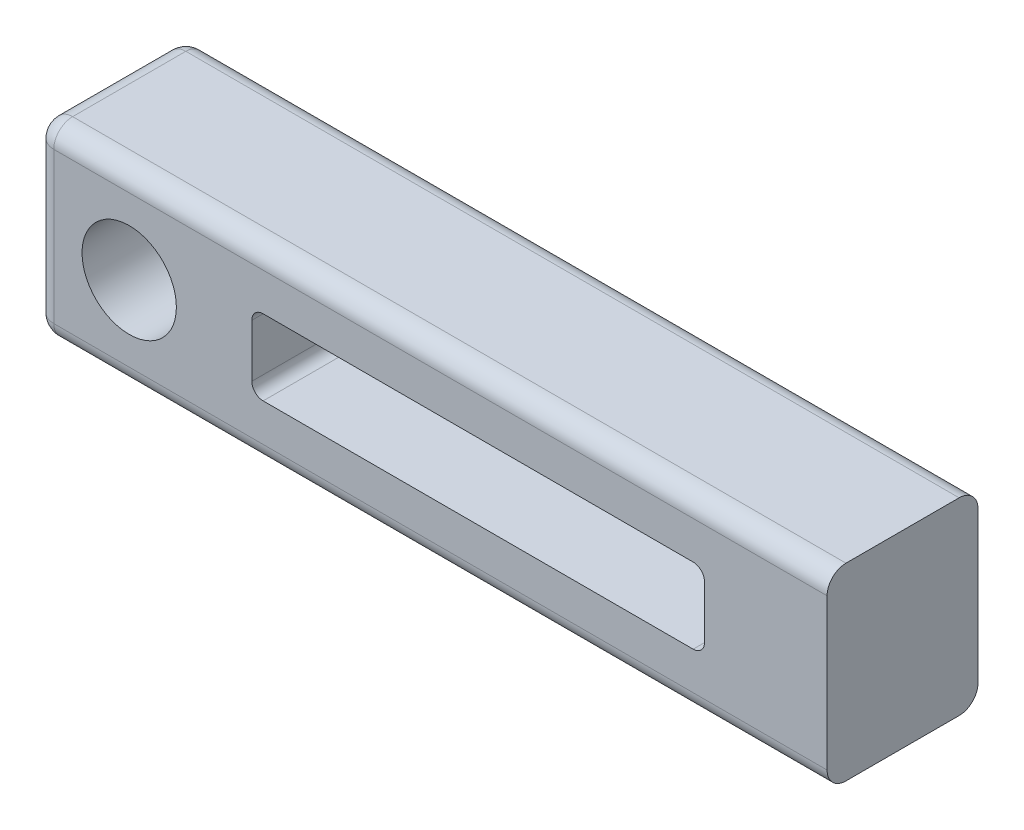
ISO-10303-21;
HEADER;
FILE_DESCRIPTION(('STEP AP214'),'2;1');
FILE_NAME('part.step','',(''),(''),'','','');
FILE_SCHEMA(('AUTOMOTIVE_DESIGN { 1 0 10303 214 1 1 1 1 }'));
ENDSEC;
DATA;
#1=APPLICATION_CONTEXT('core data for automotive mechanical design processes');
#2=APPLICATION_PROTOCOL_DEFINITION('international standard','automotive_design',2000,#1);
#3=PRODUCT_CONTEXT('',#1,'mechanical');
#4=PRODUCT('Part','Part','',(#3));
#5=PRODUCT_RELATED_PRODUCT_CATEGORY('part','',(#4));
#6=PRODUCT_DEFINITION_FORMATION('','',#4);
#7=PRODUCT_DEFINITION_CONTEXT('part definition',#1,'design');
#8=PRODUCT_DEFINITION('design','',#6,#7);
#9=PRODUCT_DEFINITION_SHAPE('','',#8);
#10=(LENGTH_UNIT() NAMED_UNIT(*) SI_UNIT(.MILLI.,.METRE.));
#11=(NAMED_UNIT(*) PLANE_ANGLE_UNIT() SI_UNIT($,.RADIAN.));
#12=(NAMED_UNIT(*) SI_UNIT($,.STERADIAN.) SOLID_ANGLE_UNIT());
#13=UNCERTAINTY_MEASURE_WITH_UNIT(LENGTH_MEASURE(1.E-05),#10,'distance_accuracy_value','');
#14=(GEOMETRIC_REPRESENTATION_CONTEXT(3) GLOBAL_UNCERTAINTY_ASSIGNED_CONTEXT((#13)) GLOBAL_UNIT_ASSIGNED_CONTEXT((#10,
#11,#12)) REPRESENTATION_CONTEXT('',''));
#15=CARTESIAN_POINT('',(0.,0.,0.));
#16=DIRECTION('',(0.,0.,1.));
#17=DIRECTION('',(1.,0.,0.));
#18=AXIS2_PLACEMENT_3D('',#15,#16,#17);
#19=CARTESIAN_POINT('',(0.,0.,40.));
#20=DIRECTION('',(0.,0.,-1.));
#21=DIRECTION('',(-1.,0.,0.));
#22=AXIS2_PLACEMENT_3D('',#19,#20,#21);
#23=PLANE('',#22);
#24=DIRECTION('',(0.,-1.,0.));
#25=VECTOR('',#24,1.);
#26=CARTESIAN_POINT('',(32.5007823221935,6.99999999999997,40.));
#27=LINE('',#26,#25);
#28=CARTESIAN_POINT('',(32.5007823221935,6.99999999999997,40.));
#29=VERTEX_POINT('',#28);
#30=CARTESIAN_POINT('',(32.5007823221935,-6.99999999999997,40.));
#31=VERTEX_POINT('',#30);
#32=EDGE_CURVE('E204',#29,#31,#27,.T.);
#33=ORIENTED_EDGE('',*,*,#32,.F.);
#34=CARTESIAN_POINT('',(35.5007823221935,7.,40.));
#35=DIRECTION('',(0.,0.,1.));
#36=DIRECTION('',(-1.,0.,0.));
#37=AXIS2_PLACEMENT_3D('',#34,#35,#36);
#38=CIRCLE('',#37,3.);
#39=CARTESIAN_POINT('',(35.5007823221935,9.99999999999999,40.));
#40=VERTEX_POINT('',#39);
#41=EDGE_CURVE('E56',#40,#29,#38,.T.);
#42=ORIENTED_EDGE('',*,*,#41,.F.);
#43=DIRECTION('',(-1.,0.,0.));
#44=VECTOR('',#43,1.);
#45=CARTESIAN_POINT('',(149.499217677806,9.99999999999999,40.));
#46=LINE('',#45,#44);
#47=CARTESIAN_POINT('',(149.499217677806,9.99999999999999,40.));
#48=VERTEX_POINT('',#47);
#49=EDGE_CURVE('E184',#48,#40,#46,.T.);
#50=ORIENTED_EDGE('',*,*,#49,.F.);
#51=CARTESIAN_POINT('',(149.499217677806,6.99999999999999,40.));
#52=DIRECTION('',(0.,0.,1.));
#53=DIRECTION('',(1.,0.,0.));
#54=AXIS2_PLACEMENT_3D('',#51,#52,#53);
#55=CIRCLE('',#54,3.);
#56=CARTESIAN_POINT('',(152.499217677806,6.99999999999997,40.));
#57=VERTEX_POINT('',#56);
#58=EDGE_CURVE('E187',#57,#48,#55,.T.);
#59=ORIENTED_EDGE('',*,*,#58,.F.);
#60=DIRECTION('',(0.,1.,0.));
#61=VECTOR('',#60,1.);
#62=CARTESIAN_POINT('',(152.499217677806,6.99999999999997,40.));
#63=LINE('',#62,#61);
#64=CARTESIAN_POINT('',(152.499217677806,-6.99999999999993,40.));
#65=VERTEX_POINT('',#64);
#66=EDGE_CURVE('E215',#65,#57,#63,.T.);
#67=ORIENTED_EDGE('',*,*,#66,.F.);
#68=CARTESIAN_POINT('',(149.499217677806,-6.99999999999995,40.));
#69=DIRECTION('',(0.,0.,1.));
#70=DIRECTION('',(-1.,0.,0.));
#71=AXIS2_PLACEMENT_3D('',#68,#69,#70);
#72=CIRCLE('',#71,3.);
#73=CARTESIAN_POINT('',(149.499217677806,-9.99999999999995,40.));
#74=VERTEX_POINT('',#73);
#75=EDGE_CURVE('E212',#74,#65,#72,.T.);
#76=ORIENTED_EDGE('',*,*,#75,.F.);
#77=DIRECTION('',(1.,0.,0.));
#78=VECTOR('',#77,1.);
#79=CARTESIAN_POINT('',(149.499217677806,-9.99999999999995,40.));
#80=LINE('',#79,#78);
#81=CARTESIAN_POINT('',(35.5007823221935,-9.99999999999999,40.));
#82=VERTEX_POINT('',#81);
#83=EDGE_CURVE('E209',#82,#74,#80,.T.);
#84=ORIENTED_EDGE('',*,*,#83,.F.);
#85=CARTESIAN_POINT('',(35.5007823221935,-6.99999999999999,40.));
#86=DIRECTION('',(0.,0.,1.));
#87=DIRECTION('',(1.,0.,0.));
#88=AXIS2_PLACEMENT_3D('',#85,#86,#87);
#89=CIRCLE('',#88,3.);
#90=EDGE_CURVE('E206',#31,#82,#89,.T.);
#91=ORIENTED_EDGE('',*,*,#90,.F.);
#92=EDGE_LOOP('',(#33,#42,#50,#59,#67,#76,#84,#91));
#93=FACE_BOUND('',#92,.T.);
#94=DIRECTION('',(0.,-1.,0.));
#95=VECTOR('',#94,1.);
#96=CARTESIAN_POINT('',(-20.,0.,40.));
#97=LINE('',#96,#95);
#98=CARTESIAN_POINT('',(-20.,20.,40.));
#99=VERTEX_POINT('',#98);
#100=CARTESIAN_POINT('',(-20.,-20.,40.));
#101=VERTEX_POINT('',#100);
#102=EDGE_CURVE('E276',#99,#101,#97,.T.);
#103=ORIENTED_EDGE('',*,*,#102,.T.);
#104=DIRECTION('',(1.,0.,0.));
#105=VECTOR('',#104,1.);
#106=CARTESIAN_POINT('',(0.,-20.,40.));
#107=LINE('',#106,#105);
#108=CARTESIAN_POINT('',(185.,-19.9999999999999,40.));
#109=VERTEX_POINT('',#108);
#110=EDGE_CURVE('E278',#101,#109,#107,.T.);
#111=ORIENTED_EDGE('',*,*,#110,.T.);
#112=DIRECTION('',(0.,1.,0.));
#113=VECTOR('',#112,1.);
#114=CARTESIAN_POINT('',(185.,25.,40.));
#115=LINE('',#114,#113);
#116=CARTESIAN_POINT('',(185.,20.,40.));
#117=VERTEX_POINT('',#116);
#118=EDGE_CURVE('E243',#109,#117,#115,.T.);
#119=ORIENTED_EDGE('',*,*,#118,.T.);
#120=DIRECTION('',(-1.,0.,0.));
#121=VECTOR('',#120,1.);
#122=CARTESIAN_POINT('',(0.,20.,40.));
#123=LINE('',#122,#121);
#124=EDGE_CURVE('E274',#117,#99,#123,.T.);
#125=ORIENTED_EDGE('',*,*,#124,.T.);
#126=EDGE_LOOP('',(#103,#111,#119,#125));
#127=FACE_BOUND('',#126,.T.);
#128=CARTESIAN_POINT('',(0.,0.,40.));
#129=DIRECTION('',(0.,0.,1.));
#130=DIRECTION('',(1.,0.,0.));
#131=AXIS2_PLACEMENT_3D('',#128,#129,#130);
#132=CIRCLE('',#131,12.5);
#133=CARTESIAN_POINT('',(12.5,0.,40.));
#134=VERTEX_POINT('',#133);
#135=EDGE_CURVE('E234',#134,#134,#132,.T.);
#136=ORIENTED_EDGE('',*,*,#135,.F.);
#137=EDGE_LOOP('',(#136));
#138=FACE_BOUND('',#137,.T.);
#139=ADVANCED_FACE('F39',(#93,#127,#138),#23,.F.);
#140=CARTESIAN_POINT('',(0.,0.,0.));
#141=DIRECTION('',(0.,0.,-1.));
#142=DIRECTION('',(-1.,0.,0.));
#143=AXIS2_PLACEMENT_3D('',#140,#141,#142);
#144=PLANE('',#143);
#145=CARTESIAN_POINT('',(35.5007823221935,7.,0.));
#146=DIRECTION('',(0.,0.,1.));
#147=DIRECTION('',(-1.,0.,0.));
#148=AXIS2_PLACEMENT_3D('',#145,#146,#147);
#149=CIRCLE('',#148,3.);
#150=CARTESIAN_POINT('',(35.5007823221935,9.99999999999999,0.));
#151=VERTEX_POINT('',#150);
#152=CARTESIAN_POINT('',(32.5007823221935,6.99999999999997,0.));
#153=VERTEX_POINT('',#152);
#154=EDGE_CURVE('E167',#151,#153,#149,.T.);
#155=ORIENTED_EDGE('',*,*,#154,.T.);
#156=DIRECTION('',(0.,-1.,0.));
#157=VECTOR('',#156,1.);
#158=CARTESIAN_POINT('',(32.5007823221935,6.99999999999997,0.));
#159=LINE('',#158,#157);
#160=CARTESIAN_POINT('',(32.5007823221935,-6.99999999999997,0.));
#161=VERTEX_POINT('',#160);
#162=EDGE_CURVE('E176',#153,#161,#159,.T.);
#163=ORIENTED_EDGE('',*,*,#162,.T.);
#164=CARTESIAN_POINT('',(35.5007823221935,-6.99999999999999,0.));
#165=DIRECTION('',(0.,0.,1.));
#166=DIRECTION('',(1.,0.,0.));
#167=AXIS2_PLACEMENT_3D('',#164,#165,#166);
#168=CIRCLE('',#167,3.);
#169=CARTESIAN_POINT('',(35.5007823221935,-9.99999999999999,0.));
#170=VERTEX_POINT('',#169);
#171=EDGE_CURVE('E64',#161,#170,#168,.T.);
#172=ORIENTED_EDGE('',*,*,#171,.T.);
#173=DIRECTION('',(1.,0.,0.));
#174=VECTOR('',#173,1.);
#175=CARTESIAN_POINT('',(149.499217677806,-9.99999999999995,0.));
#176=LINE('',#175,#174);
#177=CARTESIAN_POINT('',(149.499217677806,-9.99999999999995,0.));
#178=VERTEX_POINT('',#177);
#179=EDGE_CURVE('E191',#170,#178,#176,.T.);
#180=ORIENTED_EDGE('',*,*,#179,.T.);
#181=CARTESIAN_POINT('',(149.499217677806,-6.99999999999995,0.));
#182=DIRECTION('',(0.,0.,1.));
#183=DIRECTION('',(-1.,0.,0.));
#184=AXIS2_PLACEMENT_3D('',#181,#182,#183);
#185=CIRCLE('',#184,3.);
#186=CARTESIAN_POINT('',(152.499217677806,-6.99999999999993,0.));
#187=VERTEX_POINT('',#186);
#188=EDGE_CURVE('E194',#178,#187,#185,.T.);
#189=ORIENTED_EDGE('',*,*,#188,.T.);
#190=DIRECTION('',(0.,1.,0.));
#191=VECTOR('',#190,1.);
#192=CARTESIAN_POINT('',(152.499217677806,6.99999999999997,0.));
#193=LINE('',#192,#191);
#194=CARTESIAN_POINT('',(152.499217677806,6.99999999999997,0.));
#195=VERTEX_POINT('',#194);
#196=EDGE_CURVE('E197',#187,#195,#193,.T.);
#197=ORIENTED_EDGE('',*,*,#196,.T.);
#198=CARTESIAN_POINT('',(149.499217677806,6.99999999999999,0.));
#199=DIRECTION('',(0.,0.,1.));
#200=DIRECTION('',(1.,0.,0.));
#201=AXIS2_PLACEMENT_3D('',#198,#199,#200);
#202=CIRCLE('',#201,3.);
#203=CARTESIAN_POINT('',(149.499217677806,9.99999999999999,0.));
#204=VERTEX_POINT('',#203);
#205=EDGE_CURVE('E200',#195,#204,#202,.T.);
#206=ORIENTED_EDGE('',*,*,#205,.T.);
#207=DIRECTION('',(-1.,0.,0.));
#208=VECTOR('',#207,1.);
#209=CARTESIAN_POINT('',(149.499217677806,9.99999999999999,0.));
#210=LINE('',#209,#208);
#211=EDGE_CURVE('E173',#204,#151,#210,.T.);
#212=ORIENTED_EDGE('',*,*,#211,.T.);
#213=EDGE_LOOP('',(#155,#163,#172,#180,#189,#197,#206,#212));
#214=FACE_BOUND('',#213,.T.);
#215=DIRECTION('',(0.,1.,0.));
#216=VECTOR('',#215,1.);
#217=CARTESIAN_POINT('',(185.,25.,0.));
#218=LINE('',#217,#216);
#219=CARTESIAN_POINT('',(185.,-19.9999999999999,0.));
#220=VERTEX_POINT('',#219);
#221=CARTESIAN_POINT('',(185.,20.,0.));
#222=VERTEX_POINT('',#221);
#223=EDGE_CURVE('E238',#220,#222,#218,.T.);
#224=ORIENTED_EDGE('',*,*,#223,.F.);
#225=DIRECTION('',(1.,0.,0.));
#226=VECTOR('',#225,1.);
#227=CARTESIAN_POINT('',(-25.,-20.,0.));
#228=LINE('',#227,#226);
#229=CARTESIAN_POINT('',(-20.,-20.,0.));
#230=VERTEX_POINT('',#229);
#231=EDGE_CURVE('E290',#220,#230,#228,.F.);
#232=ORIENTED_EDGE('',*,*,#231,.T.);
#233=DIRECTION('',(0.,-1.,0.));
#234=VECTOR('',#233,1.);
#235=CARTESIAN_POINT('',(-20.,25.,0.));
#236=LINE('',#235,#234);
#237=CARTESIAN_POINT('',(-20.,20.,0.));
#238=VERTEX_POINT('',#237);
#239=EDGE_CURVE('E288',#230,#238,#236,.F.);
#240=ORIENTED_EDGE('',*,*,#239,.T.);
#241=DIRECTION('',(-1.,0.,0.));
#242=VECTOR('',#241,1.);
#243=CARTESIAN_POINT('',(185.,20.,0.));
#244=LINE('',#243,#242);
#245=EDGE_CURVE('E286',#238,#222,#244,.F.);
#246=ORIENTED_EDGE('',*,*,#245,.T.);
#247=EDGE_LOOP('',(#224,#232,#240,#246));
#248=FACE_BOUND('',#247,.T.);
#249=CARTESIAN_POINT('',(0.,0.,0.));
#250=DIRECTION('',(0.,0.,1.));
#251=DIRECTION('',(1.,0.,0.));
#252=AXIS2_PLACEMENT_3D('',#249,#250,#251);
#253=CIRCLE('',#252,12.5);
#254=CARTESIAN_POINT('',(12.5,0.,0.));
#255=VERTEX_POINT('',#254);
#256=EDGE_CURVE('E239',#255,#255,#253,.T.);
#257=ORIENTED_EDGE('',*,*,#256,.T.);
#258=EDGE_LOOP('',(#257));
#259=FACE_BOUND('',#258,.T.);
#260=ADVANCED_FACE('F180',(#214,#248,#259),#144,.T.);
#261=CARTESIAN_POINT('',(-25.,-25.,40.));
#262=DIRECTION('',(0.,1.,0.));
#263=DIRECTION('',(-1.,0.,0.));
#264=AXIS2_PLACEMENT_3D('',#261,#262,#263);
#265=PLANE('',#264);
#266=DIRECTION('',(0.,0.,-1.));
#267=VECTOR('',#266,1.);
#268=CARTESIAN_POINT('',(185.,-25.,40.));
#269=LINE('',#268,#267);
#270=CARTESIAN_POINT('',(185.,-25.,35.));
#271=VERTEX_POINT('',#270);
#272=CARTESIAN_POINT('',(185.,-25.,5.));
#273=VERTEX_POINT('',#272);
#274=EDGE_CURVE('E254',#271,#273,#269,.T.);
#275=ORIENTED_EDGE('',*,*,#274,.F.);
#276=DIRECTION('',(1.,0.,0.));
#277=VECTOR('',#276,1.);
#278=CARTESIAN_POINT('',(-25.,-25.,35.));
#279=LINE('',#278,#277);
#280=CARTESIAN_POINT('',(-20.,-25.,35.));
#281=VERTEX_POINT('',#280);
#282=EDGE_CURVE('E284',#271,#281,#279,.F.);
#283=ORIENTED_EDGE('',*,*,#282,.T.);
#284=DIRECTION('',(0.,0.,-1.));
#285=VECTOR('',#284,1.);
#286=CARTESIAN_POINT('',(-20.,-25.,40.));
#287=LINE('',#286,#285);
#288=CARTESIAN_POINT('',(-20.,-25.,5.));
#289=VERTEX_POINT('',#288);
#290=EDGE_CURVE('E282',#281,#289,#287,.T.);
#291=ORIENTED_EDGE('',*,*,#290,.T.);
#292=DIRECTION('',(1.,0.,0.));
#293=VECTOR('',#292,1.);
#294=CARTESIAN_POINT('',(185.,-25.,5.));
#295=LINE('',#294,#293);
#296=EDGE_CURVE('E280',#289,#273,#295,.T.);
#297=ORIENTED_EDGE('',*,*,#296,.T.);
#298=EDGE_LOOP('',(#275,#283,#291,#297));
#299=FACE_BOUND('',#298,.T.);
#300=ADVANCED_FACE('F353',(#299),#265,.F.);
#301=CARTESIAN_POINT('',(185.,25.,40.));
#302=DIRECTION('',(-1.,0.,0.));
#303=DIRECTION('',(0.,0.,1.));
#304=AXIS2_PLACEMENT_3D('',#301,#302,#303);
#305=PLANE('',#304);
#306=ORIENTED_EDGE('',*,*,#118,.F.);
#307=CARTESIAN_POINT('',(185.,-19.9999999999999,35.));
#308=DIRECTION('',(-1.,0.,0.));
#309=DIRECTION('',(0.,0.,1.));
#310=AXIS2_PLACEMENT_3D('',#307,#308,#309);
#311=CIRCLE('',#310,5.);
#312=EDGE_CURVE('E11',#109,#271,#311,.F.);
#313=ORIENTED_EDGE('',*,*,#312,.T.);
#314=ORIENTED_EDGE('',*,*,#274,.T.);
#315=CARTESIAN_POINT('',(185.,-19.9999999999999,5.));
#316=DIRECTION('',(-1.,0.,0.));
#317=DIRECTION('',(0.,0.,1.));
#318=AXIS2_PLACEMENT_3D('',#315,#316,#317);
#319=CIRCLE('',#318,5.);
#320=EDGE_CURVE('E48',#273,#220,#319,.F.);
#321=ORIENTED_EDGE('',*,*,#320,.T.);
#322=ORIENTED_EDGE('',*,*,#223,.T.);
#323=CARTESIAN_POINT('',(185.,20.,5.));
#324=DIRECTION('',(-1.,0.,0.));
#325=DIRECTION('',(0.,0.,1.));
#326=AXIS2_PLACEMENT_3D('',#323,#324,#325);
#327=CIRCLE('',#326,5.);
#328=CARTESIAN_POINT('',(185.,25.,5.));
#329=VERTEX_POINT('',#328);
#330=EDGE_CURVE('E294',#222,#329,#327,.F.);
#331=ORIENTED_EDGE('',*,*,#330,.T.);
#332=DIRECTION('',(0.,0.,-1.));
#333=VECTOR('',#332,1.);
#334=CARTESIAN_POINT('',(185.,25.,40.));
#335=LINE('',#334,#333);
#336=CARTESIAN_POINT('',(185.,25.,35.));
#337=VERTEX_POINT('',#336);
#338=EDGE_CURVE('E247',#337,#329,#335,.T.);
#339=ORIENTED_EDGE('',*,*,#338,.F.);
#340=CARTESIAN_POINT('',(185.,20.,35.));
#341=DIRECTION('',(-1.,0.,0.));
#342=DIRECTION('',(0.,0.,1.));
#343=AXIS2_PLACEMENT_3D('',#340,#341,#342);
#344=CIRCLE('',#343,5.);
#345=EDGE_CURVE('E292',#337,#117,#344,.F.);
#346=ORIENTED_EDGE('',*,*,#345,.T.);
#347=EDGE_LOOP('',(#306,#313,#314,#321,#322,#331,#339,#346));
#348=FACE_BOUND('',#347,.T.);
#349=ADVANCED_FACE('F363',(#348),#305,.F.);
#350=CARTESIAN_POINT('',(-25.,25.,40.));
#351=DIRECTION('',(0.,-1.,0.));
#352=DIRECTION('',(0.,0.,-1.));
#353=AXIS2_PLACEMENT_3D('',#350,#351,#352);
#354=PLANE('',#353);
#355=ORIENTED_EDGE('',*,*,#338,.T.);
#356=DIRECTION('',(-1.,0.,0.));
#357=VECTOR('',#356,1.);
#358=CARTESIAN_POINT('',(-25.,25.,5.));
#359=LINE('',#358,#357);
#360=CARTESIAN_POINT('',(-20.,25.,5.));
#361=VERTEX_POINT('',#360);
#362=EDGE_CURVE('E272',#329,#361,#359,.T.);
#363=ORIENTED_EDGE('',*,*,#362,.T.);
#364=DIRECTION('',(0.,0.,-1.));
#365=VECTOR('',#364,1.);
#366=CARTESIAN_POINT('',(-20.,25.,40.));
#367=LINE('',#366,#365);
#368=CARTESIAN_POINT('',(-20.,25.,35.));
#369=VERTEX_POINT('',#368);
#370=EDGE_CURVE('E269',#361,#369,#367,.F.);
#371=ORIENTED_EDGE('',*,*,#370,.T.);
#372=DIRECTION('',(-1.,0.,0.));
#373=VECTOR('',#372,1.);
#374=CARTESIAN_POINT('',(-25.,25.,35.));
#375=LINE('',#374,#373);
#376=EDGE_CURVE('E267',#369,#337,#375,.F.);
#377=ORIENTED_EDGE('',*,*,#376,.T.);
#378=EDGE_LOOP('',(#355,#363,#371,#377));
#379=FACE_BOUND('',#378,.T.);
#380=ADVANCED_FACE('F382',(#379),#354,.F.);
#381=CARTESIAN_POINT('',(-25.,-25.,40.));
#382=DIRECTION('',(1.,0.,0.));
#383=DIRECTION('',(0.,1.,0.));
#384=AXIS2_PLACEMENT_3D('',#381,#382,#383);
#385=PLANE('',#384);
#386=DIRECTION('',(0.,-1.,0.));
#387=VECTOR('',#386,1.);
#388=CARTESIAN_POINT('',(-25.,-25.,35.));
#389=LINE('',#388,#387);
#390=CARTESIAN_POINT('',(-25.,-20.,35.));
#391=VERTEX_POINT('',#390);
#392=CARTESIAN_POINT('',(-25.,20.,35.));
#393=VERTEX_POINT('',#392);
#394=EDGE_CURVE('E262',#391,#393,#389,.F.);
#395=ORIENTED_EDGE('',*,*,#394,.T.);
#396=DIRECTION('',(0.,0.,-1.));
#397=VECTOR('',#396,1.);
#398=CARTESIAN_POINT('',(-25.,20.,40.));
#399=LINE('',#398,#397);
#400=CARTESIAN_POINT('',(-25.,20.,5.));
#401=VERTEX_POINT('',#400);
#402=EDGE_CURVE('E264',#393,#401,#399,.T.);
#403=ORIENTED_EDGE('',*,*,#402,.T.);
#404=DIRECTION('',(0.,-1.,0.));
#405=VECTOR('',#404,1.);
#406=CARTESIAN_POINT('',(-25.,-25.,5.));
#407=LINE('',#406,#405);
#408=CARTESIAN_POINT('',(-25.,-20.,5.));
#409=VERTEX_POINT('',#408);
#410=EDGE_CURVE('E258',#401,#409,#407,.T.);
#411=ORIENTED_EDGE('',*,*,#410,.T.);
#412=DIRECTION('',(0.,0.,-1.));
#413=VECTOR('',#412,1.);
#414=CARTESIAN_POINT('',(-25.,-20.,40.));
#415=LINE('',#414,#413);
#416=EDGE_CURVE('E260',#409,#391,#415,.F.);
#417=ORIENTED_EDGE('',*,*,#416,.T.);
#418=EDGE_LOOP('',(#395,#403,#411,#417));
#419=FACE_BOUND('',#418,.T.);
#420=ADVANCED_FACE('F342',(#419),#385,.F.);
#421=CARTESIAN_POINT('',(0.,0.,40.));
#422=DIRECTION('',(0.,0.,-1.));
#423=DIRECTION('',(-1.,0.,0.));
#424=AXIS2_PLACEMENT_3D('',#421,#422,#423);
#425=CYLINDRICAL_SURFACE('',#424,12.5);
#426=ORIENTED_EDGE('',*,*,#135,.T.);
#427=EDGE_LOOP('',(#426));
#428=FACE_BOUND('',#427,.T.);
#429=ORIENTED_EDGE('',*,*,#256,.F.);
#430=EDGE_LOOP('',(#429));
#431=FACE_BOUND('',#430,.T.);
#432=ADVANCED_FACE('F393',(#428,#431),#425,.F.);
#433=CARTESIAN_POINT('',(0.,-20.,35.));
#434=DIRECTION('',(1.,0.,0.));
#435=DIRECTION('',(0.,1.,0.));
#436=AXIS2_PLACEMENT_3D('',#433,#434,#435);
#437=CYLINDRICAL_SURFACE('',#436,5.);
#438=ORIENTED_EDGE('',*,*,#312,.F.);
#439=ORIENTED_EDGE('',*,*,#110,.F.);
#440=CARTESIAN_POINT('',(-20.,-20.,35.));
#441=DIRECTION('',(-1.,0.,0.));
#442=DIRECTION('',(0.,0.,1.));
#443=AXIS2_PLACEMENT_3D('',#440,#441,#442);
#444=CIRCLE('',#443,5.);
#445=EDGE_CURVE('E43',#281,#101,#444,.T.);
#446=ORIENTED_EDGE('',*,*,#445,.F.);
#447=ORIENTED_EDGE('',*,*,#282,.F.);
#448=EDGE_LOOP('',(#438,#439,#446,#447));
#449=FACE_BOUND('',#448,.T.);
#450=ADVANCED_FACE('F41',(#449),#437,.T.);
#451=CARTESIAN_POINT('',(-20.,-20.,40.));
#452=DIRECTION('',(0.,0.,-1.));
#453=DIRECTION('',(-1.,0.,0.));
#454=AXIS2_PLACEMENT_3D('',#451,#452,#453);
#455=CYLINDRICAL_SURFACE('',#454,5.);
#456=CARTESIAN_POINT('',(-20.,-20.,5.));
#457=DIRECTION('',(0.,0.,-1.));
#458=DIRECTION('',(-1.,0.,0.));
#459=AXIS2_PLACEMENT_3D('',#456,#457,#458);
#460=CIRCLE('',#459,5.);
#461=EDGE_CURVE('E321',#289,#409,#460,.T.);
#462=ORIENTED_EDGE('',*,*,#461,.F.);
#463=ORIENTED_EDGE('',*,*,#290,.F.);
#464=CARTESIAN_POINT('',(-20.,-20.,35.));
#465=DIRECTION('',(0.,0.,1.));
#466=DIRECTION('',(1.,0.,0.));
#467=AXIS2_PLACEMENT_3D('',#464,#465,#466);
#468=CIRCLE('',#467,5.);
#469=EDGE_CURVE('E323',#391,#281,#468,.T.);
#470=ORIENTED_EDGE('',*,*,#469,.F.);
#471=ORIENTED_EDGE('',*,*,#416,.F.);
#472=EDGE_LOOP('',(#462,#463,#470,#471));
#473=FACE_BOUND('',#472,.T.);
#474=ADVANCED_FACE('F349',(#473),#455,.T.);
#475=CARTESIAN_POINT('',(-25.,-20.,5.));
#476=DIRECTION('',(-1.,0.,0.));
#477=DIRECTION('',(0.,-1.,0.));
#478=AXIS2_PLACEMENT_3D('',#475,#476,#477);
#479=CYLINDRICAL_SURFACE('',#478,5.);
#480=ORIENTED_EDGE('',*,*,#320,.F.);
#481=ORIENTED_EDGE('',*,*,#296,.F.);
#482=CARTESIAN_POINT('',(-20.,-20.,5.));
#483=DIRECTION('',(-1.,0.,0.));
#484=DIRECTION('',(0.,0.,1.));
#485=AXIS2_PLACEMENT_3D('',#482,#483,#484);
#486=CIRCLE('',#485,5.);
#487=EDGE_CURVE('E318',#230,#289,#486,.T.);
#488=ORIENTED_EDGE('',*,*,#487,.F.);
#489=ORIENTED_EDGE('',*,*,#231,.F.);
#490=EDGE_LOOP('',(#480,#481,#488,#489));
#491=FACE_BOUND('',#490,.T.);
#492=ADVANCED_FACE('F357',(#491),#479,.T.);
#493=CARTESIAN_POINT('',(-20.,-20.,35.));
#494=DIRECTION('',(0.,0.,1.));
#495=DIRECTION('',(1.,0.,0.));
#496=AXIS2_PLACEMENT_3D('',#493,#494,#495);
#497=SPHERICAL_SURFACE('',#496,5.);
#498=ORIENTED_EDGE('',*,*,#469,.T.);
#499=ORIENTED_EDGE('',*,*,#445,.T.);
#500=CARTESIAN_POINT('',(-20.,-20.,35.));
#501=DIRECTION('',(0.,-1.,0.));
#502=DIRECTION('',(0.,0.,-1.));
#503=AXIS2_PLACEMENT_3D('',#500,#501,#502);
#504=CIRCLE('',#503,5.);
#505=EDGE_CURVE('E315',#391,#101,#504,.F.);
#506=ORIENTED_EDGE('',*,*,#505,.F.);
#507=EDGE_LOOP('',(#498,#499,#506));
#508=FACE_BOUND('',#507,.T.);
#509=ADVANCED_FACE('F330',(#508),#497,.T.);
#510=CARTESIAN_POINT('',(-20.,-20.,5.));
#511=DIRECTION('',(0.,0.,1.));
#512=DIRECTION('',(1.,0.,0.));
#513=AXIS2_PLACEMENT_3D('',#510,#511,#512);
#514=SPHERICAL_SURFACE('',#513,5.);
#515=ORIENTED_EDGE('',*,*,#487,.T.);
#516=ORIENTED_EDGE('',*,*,#461,.T.);
#517=CARTESIAN_POINT('',(-20.,-20.,5.));
#518=DIRECTION('',(0.,-1.,0.));
#519=DIRECTION('',(0.,0.,-1.));
#520=AXIS2_PLACEMENT_3D('',#517,#518,#519);
#521=CIRCLE('',#520,5.);
#522=EDGE_CURVE('E312',#230,#409,#521,.F.);
#523=ORIENTED_EDGE('',*,*,#522,.F.);
#524=EDGE_LOOP('',(#515,#516,#523));
#525=FACE_BOUND('',#524,.T.);
#526=ADVANCED_FACE('F434',(#525),#514,.T.);
#527=CARTESIAN_POINT('',(0.,20.,35.));
#528=DIRECTION('',(-1.,0.,0.));
#529=DIRECTION('',(0.,0.,1.));
#530=AXIS2_PLACEMENT_3D('',#527,#528,#529);
#531=CYLINDRICAL_SURFACE('',#530,5.);
#532=ORIENTED_EDGE('',*,*,#345,.F.);
#533=ORIENTED_EDGE('',*,*,#376,.F.);
#534=CARTESIAN_POINT('',(-20.,20.,35.));
#535=DIRECTION('',(-1.,0.,0.));
#536=DIRECTION('',(0.,0.,1.));
#537=AXIS2_PLACEMENT_3D('',#534,#535,#536);
#538=CIRCLE('',#537,5.);
#539=EDGE_CURVE('E309',#99,#369,#538,.T.);
#540=ORIENTED_EDGE('',*,*,#539,.F.);
#541=ORIENTED_EDGE('',*,*,#124,.F.);
#542=EDGE_LOOP('',(#532,#533,#540,#541));
#543=FACE_BOUND('',#542,.T.);
#544=ADVANCED_FACE('F388',(#543),#531,.T.);
#545=CARTESIAN_POINT('',(-20.,0.,35.));
#546=DIRECTION('',(0.,-1.,0.));
#547=DIRECTION('',(1.,0.,0.));
#548=AXIS2_PLACEMENT_3D('',#545,#546,#547);
#549=CYLINDRICAL_SURFACE('',#548,5.);
#550=ORIENTED_EDGE('',*,*,#505,.T.);
#551=ORIENTED_EDGE('',*,*,#102,.F.);
#552=CARTESIAN_POINT('',(-20.,20.,35.));
#553=DIRECTION('',(0.,1.,0.));
#554=DIRECTION('',(0.,0.,1.));
#555=AXIS2_PLACEMENT_3D('',#552,#553,#554);
#556=CIRCLE('',#555,5.);
#557=EDGE_CURVE('E306',#393,#99,#556,.T.);
#558=ORIENTED_EDGE('',*,*,#557,.F.);
#559=ORIENTED_EDGE('',*,*,#394,.F.);
#560=EDGE_LOOP('',(#550,#551,#558,#559));
#561=FACE_BOUND('',#560,.T.);
#562=ADVANCED_FACE('F337',(#561),#549,.T.);
#563=CARTESIAN_POINT('',(-20.,-25.,5.));
#564=DIRECTION('',(0.,1.,0.));
#565=DIRECTION('',(-1.,0.,0.));
#566=AXIS2_PLACEMENT_3D('',#563,#564,#565);
#567=CYLINDRICAL_SURFACE('',#566,5.);
#568=ORIENTED_EDGE('',*,*,#522,.T.);
#569=ORIENTED_EDGE('',*,*,#410,.F.);
#570=CARTESIAN_POINT('',(-20.,20.,5.));
#571=DIRECTION('',(0.,1.,0.));
#572=DIRECTION('',(-1.,0.,0.));
#573=AXIS2_PLACEMENT_3D('',#570,#571,#572);
#574=CIRCLE('',#573,5.);
#575=EDGE_CURVE('E303',#238,#401,#574,.T.);
#576=ORIENTED_EDGE('',*,*,#575,.F.);
#577=ORIENTED_EDGE('',*,*,#239,.F.);
#578=EDGE_LOOP('',(#568,#569,#576,#577));
#579=FACE_BOUND('',#578,.T.);
#580=ADVANCED_FACE('F375',(#579),#567,.T.);
#581=CARTESIAN_POINT('',(-25.,20.,5.));
#582=DIRECTION('',(1.,0.,0.));
#583=DIRECTION('',(0.,0.,-1.));
#584=AXIS2_PLACEMENT_3D('',#581,#582,#583);
#585=CYLINDRICAL_SURFACE('',#584,5.);
#586=ORIENTED_EDGE('',*,*,#330,.F.);
#587=ORIENTED_EDGE('',*,*,#245,.F.);
#588=CARTESIAN_POINT('',(-20.,20.,5.));
#589=DIRECTION('',(-1.,0.,0.));
#590=DIRECTION('',(0.,0.,1.));
#591=AXIS2_PLACEMENT_3D('',#588,#589,#590);
#592=CIRCLE('',#591,5.);
#593=EDGE_CURVE('E300',#361,#238,#592,.T.);
#594=ORIENTED_EDGE('',*,*,#593,.F.);
#595=ORIENTED_EDGE('',*,*,#362,.F.);
#596=EDGE_LOOP('',(#586,#587,#594,#595));
#597=FACE_BOUND('',#596,.T.);
#598=ADVANCED_FACE('F371',(#597),#585,.T.);
#599=CARTESIAN_POINT('',(-20.,20.,35.));
#600=DIRECTION('',(0.,0.,1.));
#601=DIRECTION('',(1.,0.,0.));
#602=AXIS2_PLACEMENT_3D('',#599,#600,#601);
#603=SPHERICAL_SURFACE('',#602,5.);
#604=ORIENTED_EDGE('',*,*,#557,.T.);
#605=ORIENTED_EDGE('',*,*,#539,.T.);
#606=CARTESIAN_POINT('',(-20.,20.,35.));
#607=DIRECTION('',(0.,0.,1.));
#608=DIRECTION('',(1.,0.,0.));
#609=AXIS2_PLACEMENT_3D('',#606,#607,#608);
#610=CIRCLE('',#609,5.);
#611=EDGE_CURVE('E298',#393,#369,#610,.F.);
#612=ORIENTED_EDGE('',*,*,#611,.F.);
#613=EDGE_LOOP('',(#604,#605,#612));
#614=FACE_BOUND('',#613,.T.);
#615=ADVANCED_FACE('F422',(#614),#603,.T.);
#616=CARTESIAN_POINT('',(-20.,20.,5.));
#617=DIRECTION('',(0.,0.,1.));
#618=DIRECTION('',(1.,0.,0.));
#619=AXIS2_PLACEMENT_3D('',#616,#617,#618);
#620=SPHERICAL_SURFACE('',#619,5.);
#621=ORIENTED_EDGE('',*,*,#593,.T.);
#622=ORIENTED_EDGE('',*,*,#575,.T.);
#623=CARTESIAN_POINT('',(-20.,20.,5.));
#624=DIRECTION('',(0.,0.,-1.));
#625=DIRECTION('',(-1.,0.,0.));
#626=AXIS2_PLACEMENT_3D('',#623,#624,#625);
#627=CIRCLE('',#626,5.);
#628=EDGE_CURVE('E222',#361,#401,#627,.F.);
#629=ORIENTED_EDGE('',*,*,#628,.F.);
#630=EDGE_LOOP('',(#621,#622,#629));
#631=FACE_BOUND('',#630,.T.);
#632=ADVANCED_FACE('F378',(#631),#620,.T.);
#633=CARTESIAN_POINT('',(-20.,20.,40.));
#634=DIRECTION('',(0.,0.,-1.));
#635=DIRECTION('',(-1.,0.,0.));
#636=AXIS2_PLACEMENT_3D('',#633,#634,#635);
#637=CYLINDRICAL_SURFACE('',#636,5.);
#638=ORIENTED_EDGE('',*,*,#611,.T.);
#639=ORIENTED_EDGE('',*,*,#370,.F.);
#640=ORIENTED_EDGE('',*,*,#628,.T.);
#641=ORIENTED_EDGE('',*,*,#402,.F.);
#642=EDGE_LOOP('',(#638,#639,#640,#641));
#643=FACE_BOUND('',#642,.T.);
#644=ADVANCED_FACE('F380',(#643),#637,.T.);
#645=CARTESIAN_POINT('',(35.5007823221935,7.,0.));
#646=DIRECTION('',(0.,0.,1.));
#647=DIRECTION('',(1.,0.,0.));
#648=AXIS2_PLACEMENT_3D('',#645,#646,#647);
#649=CYLINDRICAL_SURFACE('',#648,3.);
#650=ORIENTED_EDGE('',*,*,#41,.T.);
#651=DIRECTION('',(0.,0.,1.));
#652=VECTOR('',#651,1.);
#653=CARTESIAN_POINT('',(32.5007823221935,6.99999999999997,0.));
#654=LINE('',#653,#652);
#655=EDGE_CURVE('E163',#153,#29,#654,.T.);
#656=ORIENTED_EDGE('',*,*,#655,.F.);
#657=ORIENTED_EDGE('',*,*,#154,.F.);
#658=DIRECTION('',(0.,0.,1.));
#659=VECTOR('',#658,1.);
#660=CARTESIAN_POINT('',(35.5007823221935,9.99999999999999,0.));
#661=LINE('',#660,#659);
#662=EDGE_CURVE('E220',#151,#40,#661,.T.);
#663=ORIENTED_EDGE('',*,*,#662,.T.);
#664=EDGE_LOOP('',(#650,#656,#657,#663));
#665=FACE_BOUND('',#664,.T.);
#666=ADVANCED_FACE('F165',(#665),#649,.F.);
#667=CARTESIAN_POINT('',(149.499217677806,9.99999999999999,0.));
#668=DIRECTION('',(0.,1.,0.));
#669=DIRECTION('',(-1.,0.,0.));
#670=AXIS2_PLACEMENT_3D('',#667,#668,#669);
#671=PLANE('',#670);
#672=ORIENTED_EDGE('',*,*,#49,.T.);
#673=ORIENTED_EDGE('',*,*,#662,.F.);
#674=ORIENTED_EDGE('',*,*,#211,.F.);
#675=DIRECTION('',(0.,0.,1.));
#676=VECTOR('',#675,1.);
#677=CARTESIAN_POINT('',(149.499217677806,9.99999999999999,0.));
#678=LINE('',#677,#676);
#679=EDGE_CURVE('E223',#204,#48,#678,.T.);
#680=ORIENTED_EDGE('',*,*,#679,.T.);
#681=EDGE_LOOP('',(#672,#673,#674,#680));
#682=FACE_BOUND('',#681,.T.);
#683=ADVANCED_FACE('F486',(#682),#671,.F.);
#684=CARTESIAN_POINT('',(149.499217677806,6.99999999999999,0.));
#685=DIRECTION('',(0.,0.,1.));
#686=DIRECTION('',(1.,0.,0.));
#687=AXIS2_PLACEMENT_3D('',#684,#685,#686);
#688=CYLINDRICAL_SURFACE('',#687,3.);
#689=ORIENTED_EDGE('',*,*,#58,.T.);
#690=ORIENTED_EDGE('',*,*,#679,.F.);
#691=ORIENTED_EDGE('',*,*,#205,.F.);
#692=DIRECTION('',(0.,0.,1.));
#693=VECTOR('',#692,1.);
#694=CARTESIAN_POINT('',(152.499217677806,6.99999999999997,0.));
#695=LINE('',#694,#693);
#696=EDGE_CURVE('E225',#195,#57,#695,.T.);
#697=ORIENTED_EDGE('',*,*,#696,.T.);
#698=EDGE_LOOP('',(#689,#690,#691,#697));
#699=FACE_BOUND('',#698,.T.);
#700=ADVANCED_FACE('F492',(#699),#688,.F.);
#701=CARTESIAN_POINT('',(152.499217677806,6.99999999999997,0.));
#702=DIRECTION('',(1.,0.,0.));
#703=DIRECTION('',(0.,0.,-1.));
#704=AXIS2_PLACEMENT_3D('',#701,#702,#703);
#705=PLANE('',#704);
#706=ORIENTED_EDGE('',*,*,#66,.T.);
#707=ORIENTED_EDGE('',*,*,#696,.F.);
#708=ORIENTED_EDGE('',*,*,#196,.F.);
#709=DIRECTION('',(0.,0.,1.));
#710=VECTOR('',#709,1.);
#711=CARTESIAN_POINT('',(152.499217677806,-6.99999999999993,0.));
#712=LINE('',#711,#710);
#713=EDGE_CURVE('E227',#187,#65,#712,.T.);
#714=ORIENTED_EDGE('',*,*,#713,.T.);
#715=EDGE_LOOP('',(#706,#707,#708,#714));
#716=FACE_BOUND('',#715,.T.);
#717=ADVANCED_FACE('F500',(#716),#705,.F.);
#718=CARTESIAN_POINT('',(149.499217677806,-6.99999999999995,0.));
#719=DIRECTION('',(0.,0.,1.));
#720=DIRECTION('',(1.,0.,0.));
#721=AXIS2_PLACEMENT_3D('',#718,#719,#720);
#722=CYLINDRICAL_SURFACE('',#721,3.);
#723=ORIENTED_EDGE('',*,*,#75,.T.);
#724=ORIENTED_EDGE('',*,*,#713,.F.);
#725=ORIENTED_EDGE('',*,*,#188,.F.);
#726=DIRECTION('',(0.,0.,1.));
#727=VECTOR('',#726,1.);
#728=CARTESIAN_POINT('',(149.499217677806,-9.99999999999995,0.));
#729=LINE('',#728,#727);
#730=EDGE_CURVE('E229',#178,#74,#729,.T.);
#731=ORIENTED_EDGE('',*,*,#730,.T.);
#732=EDGE_LOOP('',(#723,#724,#725,#731));
#733=FACE_BOUND('',#732,.T.);
#734=ADVANCED_FACE('F508',(#733),#722,.F.);
#735=CARTESIAN_POINT('',(149.499217677806,-9.99999999999995,0.));
#736=DIRECTION('',(0.,-1.,0.));
#737=DIRECTION('',(1.,0.,0.));
#738=AXIS2_PLACEMENT_3D('',#735,#736,#737);
#739=PLANE('',#738);
#740=ORIENTED_EDGE('',*,*,#83,.T.);
#741=ORIENTED_EDGE('',*,*,#730,.F.);
#742=ORIENTED_EDGE('',*,*,#179,.F.);
#743=DIRECTION('',(0.,0.,1.));
#744=VECTOR('',#743,1.);
#745=CARTESIAN_POINT('',(35.5007823221935,-9.99999999999999,0.));
#746=LINE('',#745,#744);
#747=EDGE_CURVE('E231',#170,#82,#746,.T.);
#748=ORIENTED_EDGE('',*,*,#747,.T.);
#749=EDGE_LOOP('',(#740,#741,#742,#748));
#750=FACE_BOUND('',#749,.T.);
#751=ADVANCED_FACE('F516',(#750),#739,.F.);
#752=CARTESIAN_POINT('',(35.5007823221935,-6.99999999999999,0.));
#753=DIRECTION('',(0.,0.,1.));
#754=DIRECTION('',(1.,0.,0.));
#755=AXIS2_PLACEMENT_3D('',#752,#753,#754);
#756=CYLINDRICAL_SURFACE('',#755,3.);
#757=ORIENTED_EDGE('',*,*,#90,.T.);
#758=ORIENTED_EDGE('',*,*,#747,.F.);
#759=ORIENTED_EDGE('',*,*,#171,.F.);
#760=DIRECTION('',(0.,0.,1.));
#761=VECTOR('',#760,1.);
#762=CARTESIAN_POINT('',(32.5007823221935,-6.99999999999997,0.));
#763=LINE('',#762,#761);
#764=EDGE_CURVE('E172',#161,#31,#763,.T.);
#765=ORIENTED_EDGE('',*,*,#764,.T.);
#766=EDGE_LOOP('',(#757,#758,#759,#765));
#767=FACE_BOUND('',#766,.T.);
#768=ADVANCED_FACE('F524',(#767),#756,.F.);
#769=CARTESIAN_POINT('',(32.5007823221935,6.99999999999997,0.));
#770=DIRECTION('',(-1.,0.,0.));
#771=DIRECTION('',(0.,0.,1.));
#772=AXIS2_PLACEMENT_3D('',#769,#770,#771);
#773=PLANE('',#772);
#774=ORIENTED_EDGE('',*,*,#32,.T.);
#775=ORIENTED_EDGE('',*,*,#764,.F.);
#776=ORIENTED_EDGE('',*,*,#162,.F.);
#777=ORIENTED_EDGE('',*,*,#655,.T.);
#778=EDGE_LOOP('',(#774,#775,#776,#777));
#779=FACE_BOUND('',#778,.T.);
#780=ADVANCED_FACE('F177',(#779),#773,.F.);
#781=CLOSED_SHELL('',(#139,#260,#300,#349,#380,#420,#432,#450,#474,#492,#509,#526,#544,#562,
#580,#598,#615,#632,#644,#666,#683,#700,#717,#734,#751,#768,#780));
#782=MANIFOLD_SOLID_BREP('B2',#781);
#783=ADVANCED_BREP_SHAPE_REPRESENTATION('',(#18,#782),#14);
#784=SHAPE_DEFINITION_REPRESENTATION(#9,#783);
ENDSEC;
END-ISO-10303-21;
